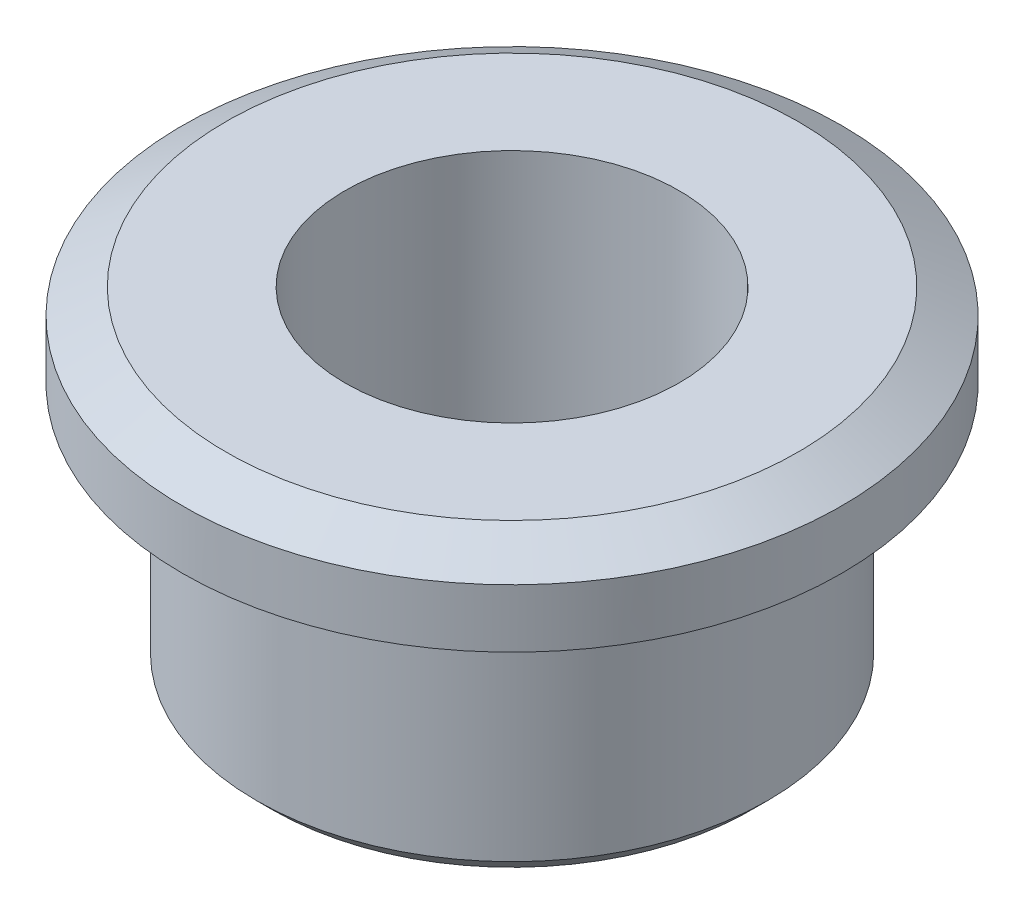
ISO-10303-21;
HEADER;
FILE_DESCRIPTION(('STEP AP214'),'2;1');
FILE_NAME('part.step','',(''),(''),'','','');
FILE_SCHEMA(('AUTOMOTIVE_DESIGN { 1 0 10303 214 1 1 1 1 }'));
ENDSEC;
DATA;
#1=APPLICATION_CONTEXT('core data for automotive mechanical design processes');
#2=APPLICATION_PROTOCOL_DEFINITION('international standard','automotive_design',2000,#1);
#3=PRODUCT_CONTEXT('',#1,'mechanical');
#4=PRODUCT('Part','Part','',(#3));
#5=PRODUCT_RELATED_PRODUCT_CATEGORY('part','',(#4));
#6=PRODUCT_DEFINITION_FORMATION('','',#4);
#7=PRODUCT_DEFINITION_CONTEXT('part definition',#1,'design');
#8=PRODUCT_DEFINITION('design','',#6,#7);
#9=PRODUCT_DEFINITION_SHAPE('','',#8);
#10=(LENGTH_UNIT() NAMED_UNIT(*) SI_UNIT(.MILLI.,.METRE.));
#11=(NAMED_UNIT(*) PLANE_ANGLE_UNIT() SI_UNIT($,.RADIAN.));
#12=(NAMED_UNIT(*) SI_UNIT($,.STERADIAN.) SOLID_ANGLE_UNIT());
#13=UNCERTAINTY_MEASURE_WITH_UNIT(LENGTH_MEASURE(1.E-05),#10,'distance_accuracy_value','');
#14=(GEOMETRIC_REPRESENTATION_CONTEXT(3) GLOBAL_UNCERTAINTY_ASSIGNED_CONTEXT((#13)) GLOBAL_UNIT_ASSIGNED_CONTEXT((#10,
#11,#12)) REPRESENTATION_CONTEXT('',''));
#15=CARTESIAN_POINT('',(0.,0.,0.));
#16=DIRECTION('',(0.,0.,1.));
#17=DIRECTION('',(1.,0.,0.));
#18=AXIS2_PLACEMENT_3D('',#15,#16,#17);
#19=CARTESIAN_POINT('',(0.,-3.,0.));
#20=DIRECTION('',(0.,1.,0.));
#21=DIRECTION('',(0.,0.,1.));
#22=AXIS2_PLACEMENT_3D('',#19,#20,#21);
#23=CYLINDRICAL_SURFACE('',#22,3.065);
#24=CARTESIAN_POINT('',(0.,-2.8,0.));
#25=DIRECTION('',(0.,1.,0.));
#26=DIRECTION('',(0.,0.,1.));
#27=AXIS2_PLACEMENT_3D('',#24,#25,#26);
#28=CIRCLE('',#27,3.065);
#29=CARTESIAN_POINT('',(0.,-2.8,3.065));
#30=VERTEX_POINT('',#29);
#31=EDGE_CURVE('E39',#30,#30,#28,.T.);
#32=ORIENTED_EDGE('',*,*,#31,.T.);
#33=EDGE_LOOP('',(#32));
#34=FACE_BOUND('',#33,.T.);
#35=CARTESIAN_POINT('',(0.,0.,0.));
#36=DIRECTION('',(0.,1.,0.));
#37=DIRECTION('',(0.,0.,1.));
#38=AXIS2_PLACEMENT_3D('',#35,#36,#37);
#39=CIRCLE('',#38,3.065);
#40=CARTESIAN_POINT('',(0.,0.,3.065));
#41=VERTEX_POINT('',#40);
#42=EDGE_CURVE('E52',#41,#41,#39,.T.);
#43=ORIENTED_EDGE('',*,*,#42,.F.);
#44=EDGE_LOOP('',(#43));
#45=FACE_BOUND('',#44,.T.);
#46=ADVANCED_FACE('F32',(#34,#45),#23,.T.);
#47=CARTESIAN_POINT('',(0.,-3.,0.));
#48=DIRECTION('',(0.,1.,0.));
#49=DIRECTION('',(0.,0.,1.));
#50=AXIS2_PLACEMENT_3D('',#47,#48,#49);
#51=PLANE('',#50);
#52=CARTESIAN_POINT('',(0.,-3.,0.));
#53=DIRECTION('',(0.,1.,0.));
#54=DIRECTION('',(0.,0.,1.));
#55=AXIS2_PLACEMENT_3D('',#52,#53,#54);
#56=CIRCLE('',#55,2.865);
#57=CARTESIAN_POINT('',(0.,-3.,2.865));
#58=VERTEX_POINT('',#57);
#59=EDGE_CURVE('E10',#58,#58,#56,.F.);
#60=ORIENTED_EDGE('',*,*,#59,.T.);
#61=EDGE_LOOP('',(#60));
#62=FACE_BOUND('',#61,.T.);
#63=CARTESIAN_POINT('',(0.,-3.,0.));
#64=DIRECTION('',(0.,1.,0.));
#65=DIRECTION('',(0.,0.,1.));
#66=AXIS2_PLACEMENT_3D('',#63,#64,#65);
#67=CIRCLE('',#66,2.);
#68=CARTESIAN_POINT('',(0.,-3.,2.));
#69=VERTEX_POINT('',#68);
#70=EDGE_CURVE('E55',#69,#69,#67,.T.);
#71=ORIENTED_EDGE('',*,*,#70,.T.);
#72=EDGE_LOOP('',(#71));
#73=FACE_BOUND('',#72,.T.);
#74=ADVANCED_FACE('F79',(#62,#73),#51,.F.);
#75=CARTESIAN_POINT('',(0.,-3.,0.));
#76=DIRECTION('',(0.,1.,0.));
#77=DIRECTION('',(0.,0.,1.));
#78=AXIS2_PLACEMENT_3D('',#75,#76,#77);
#79=CYLINDRICAL_SURFACE('',#78,2.);
#80=ORIENTED_EDGE('',*,*,#70,.F.);
#81=EDGE_LOOP('',(#80));
#82=FACE_BOUND('',#81,.T.);
#83=CARTESIAN_POINT('',(0.,1.,0.));
#84=DIRECTION('',(0.,1.,0.));
#85=DIRECTION('',(0.,0.,1.));
#86=AXIS2_PLACEMENT_3D('',#83,#84,#85);
#87=CIRCLE('',#86,2.);
#88=CARTESIAN_POINT('',(0.,1.,2.));
#89=VERTEX_POINT('',#88);
#90=EDGE_CURVE('E61',#89,#89,#87,.T.);
#91=ORIENTED_EDGE('',*,*,#90,.T.);
#92=EDGE_LOOP('',(#91));
#93=FACE_BOUND('',#92,.T.);
#94=ADVANCED_FACE('F65',(#82,#93),#79,.F.);
#95=CARTESIAN_POINT('',(0.,1.,0.));
#96=DIRECTION('',(0.,1.,0.));
#97=DIRECTION('',(0.,0.,1.));
#98=AXIS2_PLACEMENT_3D('',#95,#96,#97);
#99=PLANE('',#98);
#100=CARTESIAN_POINT('',(0.,1.,0.));
#101=DIRECTION('',(0.,1.,0.));
#102=DIRECTION('',(0.,0.,1.));
#103=AXIS2_PLACEMENT_3D('',#100,#101,#102);
#104=CIRCLE('',#103,3.43038475772933);
#105=CARTESIAN_POINT('',(0.,1.,-3.43038475772933));
#106=VERTEX_POINT('',#105);
#107=EDGE_CURVE('E47',#106,#106,#104,.T.);
#108=ORIENTED_EDGE('',*,*,#107,.T.);
#109=EDGE_LOOP('',(#108));
#110=FACE_BOUND('',#109,.T.);
#111=ORIENTED_EDGE('',*,*,#90,.F.);
#112=EDGE_LOOP('',(#111));
#113=FACE_BOUND('',#112,.T.);
#114=ADVANCED_FACE('F67',(#110,#113),#99,.T.);
#115=CARTESIAN_POINT('',(0.,0.,0.));
#116=DIRECTION('',(0.,1.,0.));
#117=DIRECTION('',(0.,0.,1.));
#118=AXIS2_PLACEMENT_3D('',#115,#116,#117);
#119=PLANE('',#118);
#120=ORIENTED_EDGE('',*,*,#42,.T.);
#121=EDGE_LOOP('',(#120));
#122=FACE_BOUND('',#121,.T.);
#123=CARTESIAN_POINT('',(0.,0.,0.));
#124=DIRECTION('',(0.,1.,0.));
#125=DIRECTION('',(0.,0.,1.));
#126=AXIS2_PLACEMENT_3D('',#123,#124,#125);
#127=CIRCLE('',#126,3.95);
#128=CARTESIAN_POINT('',(0.,0.,3.95));
#129=VERTEX_POINT('',#128);
#130=EDGE_CURVE('E58',#129,#129,#127,.T.);
#131=ORIENTED_EDGE('',*,*,#130,.F.);
#132=EDGE_LOOP('',(#131));
#133=FACE_BOUND('',#132,.T.);
#134=ADVANCED_FACE('F69',(#122,#133),#119,.F.);
#135=CARTESIAN_POINT('',(0.,1.,0.));
#136=DIRECTION('',(0.,-1.,0.));
#137=DIRECTION('',(0.,0.,-1.));
#138=AXIS2_PLACEMENT_3D('',#135,#136,#137);
#139=CYLINDRICAL_SURFACE('',#138,3.95);
#140=CARTESIAN_POINT('',(0.,0.699999999999997,0.));
#141=DIRECTION('',(0.,1.,0.));
#142=DIRECTION('',(0.,0.,1.));
#143=AXIS2_PLACEMENT_3D('',#140,#141,#142);
#144=CIRCLE('',#143,3.95);
#145=CARTESIAN_POINT('',(0.,0.699999999999997,-3.95));
#146=VERTEX_POINT('',#145);
#147=EDGE_CURVE('E43',#146,#146,#144,.F.);
#148=ORIENTED_EDGE('',*,*,#147,.T.);
#149=EDGE_LOOP('',(#148));
#150=FACE_BOUND('',#149,.T.);
#151=ORIENTED_EDGE('',*,*,#130,.T.);
#152=EDGE_LOOP('',(#151));
#153=FACE_BOUND('',#152,.T.);
#154=ADVANCED_FACE('F76',(#150,#153),#139,.T.);
#155=CARTESIAN_POINT('',(0.,1.,0.));
#156=DIRECTION('',(0.,-1.,0.));
#157=DIRECTION('',(0.,0.,-1.));
#158=AXIS2_PLACEMENT_3D('',#155,#156,#157);
#159=CONICAL_SURFACE('',#158,3.43038475772933,1.0471975511966);
#160=CARTESIAN_POINT('',(0.,0.699999999999997,-3.95));
#161=CARTESIAN_POINT('',(0.,0.703124999999997,-3.94458734122635));
#162=CARTESIAN_POINT('',(0.,0.706249999999997,-3.9391746824527));
#163=CARTESIAN_POINT('',(0.,0.712499999999997,-3.92834936490539));
#164=CARTESIAN_POINT('',(0.,0.715624999999997,-3.92293670613174));
#165=CARTESIAN_POINT('',(0.,0.721874999999997,-3.91211138858443));
#166=CARTESIAN_POINT('',(0.,0.724999999999997,-3.90669872981078));
#167=CARTESIAN_POINT('',(0.,0.731249999999997,-3.89587341226347));
#168=CARTESIAN_POINT('',(0.,0.734374999999997,-3.89046075348982));
#169=CARTESIAN_POINT('',(0.,0.740624999999997,-3.87963543594251));
#170=CARTESIAN_POINT('',(0.,0.743749999999997,-3.87422277716886));
#171=CARTESIAN_POINT('',(0.,0.749999999999998,-3.86339745962156));
#172=CARTESIAN_POINT('',(0.,0.753124999999997,-3.8579848008479));
#173=CARTESIAN_POINT('',(0.,0.759374999999998,-3.8471594833006));
#174=CARTESIAN_POINT('',(0.,0.762499999999998,-3.84174682452695));
#175=CARTESIAN_POINT('',(0.,0.768749999999998,-3.83092150697964));
#176=CARTESIAN_POINT('',(0.,0.771874999999998,-3.82550884820599));
#177=CARTESIAN_POINT('',(0.,0.778124999999998,-3.81468353065868));
#178=CARTESIAN_POINT('',(0.,0.781249999999998,-3.80927087188503));
#179=CARTESIAN_POINT('',(0.,0.787499999999998,-3.79844555433772));
#180=CARTESIAN_POINT('',(0.,0.790624999999998,-3.79303289556407));
#181=CARTESIAN_POINT('',(0.,0.796874999999998,-3.78220757801676));
#182=CARTESIAN_POINT('',(0.,0.799999999999998,-3.77679491924311));
#183=CARTESIAN_POINT('',(0.,0.806249999999998,-3.76596960169581));
#184=CARTESIAN_POINT('',(0.,0.809374999999998,-3.76055694292215));
#185=CARTESIAN_POINT('',(0.,0.815624999999998,-3.74973162537485));
#186=CARTESIAN_POINT('',(0.,0.818749999999998,-3.7443189666012));
#187=CARTESIAN_POINT('',(0.,0.824999999999998,-3.73349364905389));
#188=CARTESIAN_POINT('',(0.,0.828124999999998,-3.72808099028024));
#189=CARTESIAN_POINT('',(0.,0.834374999999998,-3.71725567273293));
#190=CARTESIAN_POINT('',(0.,0.837499999999998,-3.71184301395928));
#191=CARTESIAN_POINT('',(0.,0.843749999999998,-3.70101769641197));
#192=CARTESIAN_POINT('',(0.,0.846874999999998,-3.69560503763832));
#193=CARTESIAN_POINT('',(0.,0.853124999999998,-3.68477972009101));
#194=CARTESIAN_POINT('',(0.,0.856249999999999,-3.67936706131736));
#195=CARTESIAN_POINT('',(0.,0.862499999999999,-3.66854174377006));
#196=CARTESIAN_POINT('',(0.,0.865624999999999,-3.6631290849964));
#197=CARTESIAN_POINT('',(0.,0.871874999999999,-3.6523037674491));
#198=CARTESIAN_POINT('',(0.,0.874999999999999,-3.64689110867545));
#199=CARTESIAN_POINT('',(0.,0.881249999999999,-3.63606579112814));
#200=CARTESIAN_POINT('',(0.,0.884374999999999,-3.63065313235449));
#201=CARTESIAN_POINT('',(0.,0.890624999999999,-3.61982781480718));
#202=CARTESIAN_POINT('',(0.,0.893749999999999,-3.61441515603353));
#203=CARTESIAN_POINT('',(0.,0.899999999999999,-3.60358983848622));
#204=CARTESIAN_POINT('',(0.,0.903124999999999,-3.59817717971257));
#205=CARTESIAN_POINT('',(0.,0.909374999999999,-3.58735186216526));
#206=CARTESIAN_POINT('',(0.,0.912499999999999,-3.58193920339161));
#207=CARTESIAN_POINT('',(0.,0.918749999999999,-3.57111388584431));
#208=CARTESIAN_POINT('',(0.,0.921874999999999,-3.56570122707065));
#209=CARTESIAN_POINT('',(0.,0.928124999999999,-3.55487590952335));
#210=CARTESIAN_POINT('',(0.,0.931249999999999,-3.5494632507497));
#211=CARTESIAN_POINT('',(0.,0.937499999999999,-3.53863793320239));
#212=CARTESIAN_POINT('',(0.,0.940624999999999,-3.53322527442874));
#213=CARTESIAN_POINT('',(0.,0.946874999999999,-3.52239995688143));
#214=CARTESIAN_POINT('',(0.,0.95,-3.51698729810778));
#215=CARTESIAN_POINT('',(0.,0.956249999999999,-3.50616198056047));
#216=CARTESIAN_POINT('',(0.,0.959375,-3.50074932178682));
#217=CARTESIAN_POINT('',(0.,0.965625,-3.48992400423951));
#218=CARTESIAN_POINT('',(0.,0.96875,-3.48451134546586));
#219=CARTESIAN_POINT('',(0.,0.975,-3.47368602791856));
#220=CARTESIAN_POINT('',(0.,0.978125,-3.4682733691449));
#221=CARTESIAN_POINT('',(0.,0.984375,-3.4574480515976));
#222=CARTESIAN_POINT('',(0.,0.9875,-3.45203539282395));
#223=CARTESIAN_POINT('',(0.,0.99375,-3.44121007527664));
#224=CARTESIAN_POINT('',(0.,0.996875,-3.43579741650299));
#225=CARTESIAN_POINT('',(0.,1.,-3.43038475772933));
#226=B_SPLINE_CURVE_WITH_KNOTS('',3,(#160,#161,#162,#163,#164,#165,#166,#167,#168,#169,#170,
#171,#172,#173,#174,#175,#176,#177,#178,#179,#180,#181,#182,#183,#184,#185,#186,#187,#188,#189,
#190,#191,#192,#193,#194,#195,#196,#197,#198,#199,#200,#201,#202,#203,#204,#205,#206,#207,#208,
#209,#210,#211,#212,#213,#214,#215,#216,#217,#218,#219,#220,#221,#222,#223,#224,#225),
.UNSPECIFIED.,.F.,.F.,(4,2,2,2,2,2,2,2,2,2,2,2,2,2,2,2,2,2,2,2,2,2,2,2,2,2,2,2,2,2,2,2,4),(0.,
0.0187499999999996,0.0375,0.05625,0.0750000000000001,0.0937500000000006,0.112500000000001,
0.131250000000001,0.150000000000001,0.168750000000001,0.187500000000001,0.206250000000001,
0.225000000000001,0.243750000000002,0.262500000000002,0.281250000000002,0.300000000000002,
0.318750000000002,0.337500000000002,0.356250000000002,0.375000000000002,0.393750000000002,
0.412500000000002,0.431250000000003,0.450000000000003,0.468750000000003,0.487500000000003,
0.506250000000003,0.525000000000003,0.543750000000003,0.562500000000003,0.581250000000003,
0.600000000000004),.UNSPECIFIED.);
#227=EDGE_CURVE('BSEAM89',#146,#106,#226,.T.);
#228=ORIENTED_EDGE('',*,*,#147,.F.);
#229=ORIENTED_EDGE('',*,*,#107,.F.);
#230=ORIENTED_EDGE('',*,*,#227,.T.);
#231=ORIENTED_EDGE('',*,*,#227,.F.);
#232=EDGE_LOOP('',(#228,#230,#229,#231));
#233=FACE_BOUND('',#232,.T.);
#234=ADVANCED_FACE('F89',(#233),#159,.T.);
#235=CARTESIAN_POINT('',(0.,-2.8,0.));
#236=DIRECTION('',(0.,1.,0.));
#237=DIRECTION('',(0.,0.,1.));
#238=AXIS2_PLACEMENT_3D('',#235,#236,#237);
#239=CONICAL_SURFACE('',#238,3.065,0.78539816339745);
#240=ORIENTED_EDGE('',*,*,#59,.F.);
#241=EDGE_LOOP('',(#240));
#242=FACE_BOUND('',#241,.T.);
#243=ORIENTED_EDGE('',*,*,#31,.F.);
#244=EDGE_LOOP('',(#243));
#245=FACE_BOUND('',#244,.T.);
#246=ADVANCED_FACE('F34',(#242,#245),#239,.T.);
#247=CLOSED_SHELL('',(#46,#74,#94,#114,#134,#154,#234,#246));
#248=MANIFOLD_SOLID_BREP('B2',#247);
#249=ADVANCED_BREP_SHAPE_REPRESENTATION('',(#18,#248),#14);
#250=SHAPE_DEFINITION_REPRESENTATION(#9,#249);
ENDSEC;
END-ISO-10303-21;
